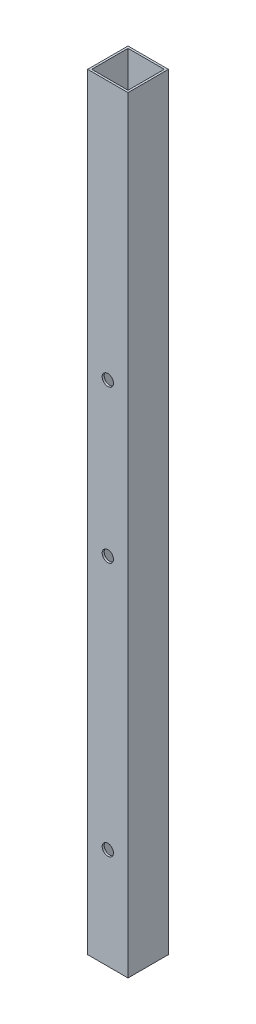
ISO-10303-21;
HEADER;
FILE_DESCRIPTION(('STEP AP214'),'2;1');
FILE_NAME('part.step','',(''),(''),'','','');
FILE_SCHEMA(('AUTOMOTIVE_DESIGN { 1 0 10303 214 1 1 1 1 }'));
ENDSEC;
DATA;
#1=APPLICATION_CONTEXT('core data for automotive mechanical design processes');
#2=APPLICATION_PROTOCOL_DEFINITION('international standard','automotive_design',2000,#1);
#3=PRODUCT_CONTEXT('',#1,'mechanical');
#4=PRODUCT('Part','Part','',(#3));
#5=PRODUCT_RELATED_PRODUCT_CATEGORY('part','',(#4));
#6=PRODUCT_DEFINITION_FORMATION('','',#4);
#7=PRODUCT_DEFINITION_CONTEXT('part definition',#1,'design');
#8=PRODUCT_DEFINITION('design','',#6,#7);
#9=PRODUCT_DEFINITION_SHAPE('','',#8);
#10=(LENGTH_UNIT() NAMED_UNIT(*) SI_UNIT(.MILLI.,.METRE.));
#11=(NAMED_UNIT(*) PLANE_ANGLE_UNIT() SI_UNIT($,.RADIAN.));
#12=(NAMED_UNIT(*) SI_UNIT($,.STERADIAN.) SOLID_ANGLE_UNIT());
#13=UNCERTAINTY_MEASURE_WITH_UNIT(LENGTH_MEASURE(1.E-05),#10,'distance_accuracy_value','');
#14=(GEOMETRIC_REPRESENTATION_CONTEXT(3) GLOBAL_UNCERTAINTY_ASSIGNED_CONTEXT((#13)) GLOBAL_UNIT_ASSIGNED_CONTEXT((#10,
#11,#12)) REPRESENTATION_CONTEXT('',''));
#15=CARTESIAN_POINT('',(0.,0.,0.));
#16=DIRECTION('',(0.,0.,1.));
#17=DIRECTION('',(1.,0.,0.));
#18=AXIS2_PLACEMENT_3D('',#15,#16,#17);
#19=CARTESIAN_POINT('',(0.,482.6,0.));
#20=DIRECTION('',(0.,-1.,0.));
#21=DIRECTION('',(0.,0.,-1.));
#22=AXIS2_PLACEMENT_3D('',#19,#20,#21);
#23=PLANE('',#22);
#24=DIRECTION('',(1.,0.,0.));
#25=VECTOR('',#24,1.);
#26=CARTESIAN_POINT('',(25.4,482.6,0.));
#27=LINE('',#26,#25);
#28=CARTESIAN_POINT('',(0.,482.6,0.));
#29=VERTEX_POINT('',#28);
#30=CARTESIAN_POINT('',(25.4,482.6,0.));
#31=VERTEX_POINT('',#30);
#32=EDGE_CURVE('E143',#29,#31,#27,.T.);
#33=ORIENTED_EDGE('',*,*,#32,.T.);
#34=DIRECTION('',(0.,0.,-1.));
#35=VECTOR('',#34,1.);
#36=CARTESIAN_POINT('',(25.4,482.6,-25.4));
#37=LINE('',#36,#35);
#38=CARTESIAN_POINT('',(25.4,482.6,-25.4));
#39=VERTEX_POINT('',#38);
#40=EDGE_CURVE('E146',#31,#39,#37,.T.);
#41=ORIENTED_EDGE('',*,*,#40,.T.);
#42=DIRECTION('',(-1.,0.,0.));
#43=VECTOR('',#42,1.);
#44=CARTESIAN_POINT('',(0.,482.6,-25.4));
#45=LINE('',#44,#43);
#46=CARTESIAN_POINT('',(0.,482.6,-25.4));
#47=VERTEX_POINT('',#46);
#48=EDGE_CURVE('E149',#39,#47,#45,.T.);
#49=ORIENTED_EDGE('',*,*,#48,.T.);
#50=DIRECTION('',(0.,0.,1.));
#51=VECTOR('',#50,1.);
#52=CARTESIAN_POINT('',(0.,482.6,0.));
#53=LINE('',#52,#51);
#54=EDGE_CURVE('E151',#47,#29,#53,.T.);
#55=ORIENTED_EDGE('',*,*,#54,.T.);
#56=EDGE_LOOP('',(#33,#41,#49,#55));
#57=FACE_BOUND('',#56,.T.);
#58=DIRECTION('',(1.,0.,0.));
#59=VECTOR('',#58,1.);
#60=CARTESIAN_POINT('',(1.27,482.6,-1.27));
#61=LINE('',#60,#59);
#62=CARTESIAN_POINT('',(1.27,482.6,-1.27));
#63=VERTEX_POINT('',#62);
#64=CARTESIAN_POINT('',(24.13,482.6,-1.27));
#65=VERTEX_POINT('',#64);
#66=EDGE_CURVE('E108',#63,#65,#61,.T.);
#67=ORIENTED_EDGE('',*,*,#66,.F.);
#68=DIRECTION('',(0.,0.,1.));
#69=VECTOR('',#68,1.);
#70=CARTESIAN_POINT('',(1.27,482.6,-12.3614591557052));
#71=LINE('',#70,#69);
#72=CARTESIAN_POINT('',(1.27,482.6,-24.13));
#73=VERTEX_POINT('',#72);
#74=EDGE_CURVE('E103',#73,#63,#71,.T.);
#75=ORIENTED_EDGE('',*,*,#74,.F.);
#76=DIRECTION('',(-1.,0.,0.));
#77=VECTOR('',#76,1.);
#78=CARTESIAN_POINT('',(12.7,482.6,-24.13));
#79=LINE('',#78,#77);
#80=CARTESIAN_POINT('',(24.13,482.6,-24.13));
#81=VERTEX_POINT('',#80);
#82=EDGE_CURVE('E124',#81,#73,#79,.T.);
#83=ORIENTED_EDGE('',*,*,#82,.F.);
#84=DIRECTION('',(0.,0.,-1.));
#85=VECTOR('',#84,1.);
#86=CARTESIAN_POINT('',(24.13,482.6,-1.27));
#87=LINE('',#86,#85);
#88=EDGE_CURVE('E122',#65,#81,#87,.T.);
#89=ORIENTED_EDGE('',*,*,#88,.F.);
#90=EDGE_LOOP('',(#67,#75,#83,#89));
#91=FACE_BOUND('',#90,.T.);
#92=ADVANCED_FACE('F39',(#57,#91),#23,.F.);
#93=CARTESIAN_POINT('',(0.,0.,0.));
#94=DIRECTION('',(0.,-1.,0.));
#95=DIRECTION('',(0.,0.,-1.));
#96=AXIS2_PLACEMENT_3D('',#93,#94,#95);
#97=PLANE('',#96);
#98=DIRECTION('',(1.,0.,0.));
#99=VECTOR('',#98,1.);
#100=CARTESIAN_POINT('',(25.4,0.,0.));
#101=LINE('',#100,#99);
#102=CARTESIAN_POINT('',(0.,0.,0.));
#103=VERTEX_POINT('',#102);
#104=CARTESIAN_POINT('',(25.4,0.,0.));
#105=VERTEX_POINT('',#104);
#106=EDGE_CURVE('E118',#103,#105,#101,.T.);
#107=ORIENTED_EDGE('',*,*,#106,.F.);
#108=DIRECTION('',(0.,0.,1.));
#109=VECTOR('',#108,1.);
#110=CARTESIAN_POINT('',(0.,0.,0.));
#111=LINE('',#110,#109);
#112=CARTESIAN_POINT('',(0.,0.,-25.4));
#113=VERTEX_POINT('',#112);
#114=EDGE_CURVE('E147',#113,#103,#111,.T.);
#115=ORIENTED_EDGE('',*,*,#114,.F.);
#116=DIRECTION('',(-1.,0.,0.));
#117=VECTOR('',#116,1.);
#118=CARTESIAN_POINT('',(0.,0.,-25.4));
#119=LINE('',#118,#117);
#120=CARTESIAN_POINT('',(25.4,0.,-25.4));
#121=VERTEX_POINT('',#120);
#122=EDGE_CURVE('E158',#121,#113,#119,.T.);
#123=ORIENTED_EDGE('',*,*,#122,.F.);
#124=DIRECTION('',(0.,0.,-1.));
#125=VECTOR('',#124,1.);
#126=CARTESIAN_POINT('',(25.4,0.,-25.4));
#127=LINE('',#126,#125);
#128=EDGE_CURVE('E156',#105,#121,#127,.T.);
#129=ORIENTED_EDGE('',*,*,#128,.F.);
#130=EDGE_LOOP('',(#107,#115,#123,#129));
#131=FACE_BOUND('',#130,.T.);
#132=DIRECTION('',(0.,0.,1.));
#133=VECTOR('',#132,1.);
#134=CARTESIAN_POINT('',(1.27,0.,-12.3614591557052));
#135=LINE('',#134,#133);
#136=CARTESIAN_POINT('',(1.27,0.,-24.13));
#137=VERTEX_POINT('',#136);
#138=CARTESIAN_POINT('',(1.27,0.,-1.27));
#139=VERTEX_POINT('',#138);
#140=EDGE_CURVE('E109',#137,#139,#135,.T.);
#141=ORIENTED_EDGE('',*,*,#140,.T.);
#142=DIRECTION('',(1.,0.,0.));
#143=VECTOR('',#142,1.);
#144=CARTESIAN_POINT('',(24.13,0.,-1.27));
#145=LINE('',#144,#143);
#146=CARTESIAN_POINT('',(24.13,0.,-1.27));
#147=VERTEX_POINT('',#146);
#148=EDGE_CURVE('E116',#139,#147,#145,.T.);
#149=ORIENTED_EDGE('',*,*,#148,.T.);
#150=DIRECTION('',(0.,0.,-1.));
#151=VECTOR('',#150,1.);
#152=CARTESIAN_POINT('',(24.13,0.,-24.13));
#153=LINE('',#152,#151);
#154=CARTESIAN_POINT('',(24.13,0.,-24.13));
#155=VERTEX_POINT('',#154);
#156=EDGE_CURVE('E130',#147,#155,#153,.T.);
#157=ORIENTED_EDGE('',*,*,#156,.T.);
#158=DIRECTION('',(-1.,0.,0.));
#159=VECTOR('',#158,1.);
#160=CARTESIAN_POINT('',(1.27,0.,-24.13));
#161=LINE('',#160,#159);
#162=EDGE_CURVE('E134',#155,#137,#161,.T.);
#163=ORIENTED_EDGE('',*,*,#162,.T.);
#164=EDGE_LOOP('',(#141,#149,#157,#163));
#165=FACE_BOUND('',#164,.T.);
#166=ADVANCED_FACE('F223',(#131,#165),#97,.T.);
#167=CARTESIAN_POINT('',(25.4,482.6,0.));
#168=DIRECTION('',(0.,0.,-1.));
#169=DIRECTION('',(-1.,0.,0.));
#170=AXIS2_PLACEMENT_3D('',#167,#168,#169);
#171=PLANE('',#170);
#172=CARTESIAN_POINT('',(12.6999999999991,223.6,0.));
#173=DIRECTION('',(0.,0.,1.));
#174=DIRECTION('',(1.,0.,0.));
#175=AXIS2_PLACEMENT_3D('',#172,#173,#174);
#176=CIRCLE('',#175,3.55599999999999);
#177=CARTESIAN_POINT('',(16.2559999999991,223.6,0.));
#178=VERTEX_POINT('',#177);
#179=EDGE_CURVE('E184',#178,#178,#176,.T.);
#180=ORIENTED_EDGE('',*,*,#179,.F.);
#181=EDGE_LOOP('',(#180));
#182=FACE_BOUND('',#181,.T.);
#183=CARTESIAN_POINT('',(12.6999999999994,319.6,0.));
#184=DIRECTION('',(0.,0.,1.));
#185=DIRECTION('',(1.,0.,0.));
#186=AXIS2_PLACEMENT_3D('',#183,#184,#185);
#187=CIRCLE('',#186,3.55599999999999);
#188=CARTESIAN_POINT('',(16.2559999999994,319.6,0.));
#189=VERTEX_POINT('',#188);
#190=EDGE_CURVE('E189',#189,#189,#187,.T.);
#191=ORIENTED_EDGE('',*,*,#190,.F.);
#192=EDGE_LOOP('',(#191));
#193=FACE_BOUND('',#192,.T.);
#194=CARTESIAN_POINT('',(12.6999999999985,63.552,0.));
#195=DIRECTION('',(0.,0.,1.));
#196=DIRECTION('',(1.,0.,0.));
#197=AXIS2_PLACEMENT_3D('',#194,#195,#196);
#198=CIRCLE('',#197,3.556);
#199=CARTESIAN_POINT('',(16.2559999999985,63.552,0.));
#200=VERTEX_POINT('',#199);
#201=EDGE_CURVE('E181',#200,#200,#198,.T.);
#202=ORIENTED_EDGE('',*,*,#201,.F.);
#203=EDGE_LOOP('',(#202));
#204=FACE_BOUND('',#203,.T.);
#205=ORIENTED_EDGE('',*,*,#106,.T.);
#206=DIRECTION('',(0.,-1.,0.));
#207=VECTOR('',#206,1.);
#208=CARTESIAN_POINT('',(25.4,482.6,0.));
#209=LINE('',#208,#207);
#210=EDGE_CURVE('E11',#31,#105,#209,.T.);
#211=ORIENTED_EDGE('',*,*,#210,.F.);
#212=ORIENTED_EDGE('',*,*,#32,.F.);
#213=DIRECTION('',(0.,-1.,0.));
#214=VECTOR('',#213,1.);
#215=CARTESIAN_POINT('',(0.,482.6,0.));
#216=LINE('',#215,#214);
#217=EDGE_CURVE('E153',#29,#103,#216,.T.);
#218=ORIENTED_EDGE('',*,*,#217,.T.);
#219=EDGE_LOOP('',(#205,#211,#212,#218));
#220=FACE_BOUND('',#219,.T.);
#221=ADVANCED_FACE('F41',(#182,#193,#204,#220),#171,.F.);
#222=CARTESIAN_POINT('',(25.4,482.6,-25.4));
#223=DIRECTION('',(-1.,0.,0.));
#224=DIRECTION('',(0.,0.,1.));
#225=AXIS2_PLACEMENT_3D('',#222,#223,#224);
#226=PLANE('',#225);
#227=ORIENTED_EDGE('',*,*,#128,.T.);
#228=DIRECTION('',(0.,-1.,0.));
#229=VECTOR('',#228,1.);
#230=CARTESIAN_POINT('',(25.4,482.6,-25.4));
#231=LINE('',#230,#229);
#232=EDGE_CURVE('E48',#39,#121,#231,.T.);
#233=ORIENTED_EDGE('',*,*,#232,.F.);
#234=ORIENTED_EDGE('',*,*,#40,.F.);
#235=ORIENTED_EDGE('',*,*,#210,.T.);
#236=EDGE_LOOP('',(#227,#233,#234,#235));
#237=FACE_BOUND('',#236,.T.);
#238=ADVANCED_FACE('F210',(#237),#226,.F.);
#239=CARTESIAN_POINT('',(0.,482.6,-25.4));
#240=DIRECTION('',(0.,0.,1.));
#241=DIRECTION('',(1.,0.,0.));
#242=AXIS2_PLACEMENT_3D('',#239,#240,#241);
#243=PLANE('',#242);
#244=CARTESIAN_POINT('',(12.715968996325,18.417917659562,-25.4));
#245=DIRECTION('',(0.,0.,-1.));
#246=DIRECTION('',(-1.,0.,0.));
#247=AXIS2_PLACEMENT_3D('',#244,#245,#246);
#248=CIRCLE('',#247,2.54);
#249=CARTESIAN_POINT('',(10.175968996325,18.417917659562,-25.4));
#250=VERTEX_POINT('',#249);
#251=EDGE_CURVE('E178',#250,#250,#248,.T.);
#252=ORIENTED_EDGE('',*,*,#251,.F.);
#253=EDGE_LOOP('',(#252));
#254=FACE_BOUND('',#253,.T.);
#255=CARTESIAN_POINT('',(12.7005737102053,321.200750094424,-25.4));
#256=DIRECTION('',(0.,0.,-1.));
#257=DIRECTION('',(-1.,0.,0.));
#258=AXIS2_PLACEMENT_3D('',#255,#256,#257);
#259=CIRCLE('',#258,2.54);
#260=CARTESIAN_POINT('',(10.1605737102053,321.200750094424,-25.4));
#261=VERTEX_POINT('',#260);
#262=EDGE_CURVE('E174',#261,#261,#259,.T.);
#263=ORIENTED_EDGE('',*,*,#262,.F.);
#264=EDGE_LOOP('',(#263));
#265=FACE_BOUND('',#264,.T.);
#266=CARTESIAN_POINT('',(12.762028980859,449.168015032484,-25.4));
#267=DIRECTION('',(0.,0.,-1.));
#268=DIRECTION('',(-1.,0.,0.));
#269=AXIS2_PLACEMENT_3D('',#266,#267,#268);
#270=CIRCLE('',#269,2.54);
#271=CARTESIAN_POINT('',(10.222028980859,449.168015032484,-25.4));
#272=VERTEX_POINT('',#271);
#273=EDGE_CURVE('E170',#272,#272,#270,.T.);
#274=ORIENTED_EDGE('',*,*,#273,.F.);
#275=EDGE_LOOP('',(#274));
#276=FACE_BOUND('',#275,.T.);
#277=ORIENTED_EDGE('',*,*,#122,.T.);
#278=DIRECTION('',(0.,-1.,0.));
#279=VECTOR('',#278,1.);
#280=CARTESIAN_POINT('',(0.,482.6,-25.4));
#281=LINE('',#280,#279);
#282=EDGE_CURVE('E163',#47,#113,#281,.T.);
#283=ORIENTED_EDGE('',*,*,#282,.F.);
#284=ORIENTED_EDGE('',*,*,#48,.F.);
#285=ORIENTED_EDGE('',*,*,#232,.T.);
#286=EDGE_LOOP('',(#277,#283,#284,#285));
#287=FACE_BOUND('',#286,.T.);
#288=ADVANCED_FACE('F206',(#254,#265,#276,#287),#243,.F.);
#289=CARTESIAN_POINT('',(0.,482.6,0.));
#290=DIRECTION('',(1.,0.,0.));
#291=DIRECTION('',(0.,0.,-1.));
#292=AXIS2_PLACEMENT_3D('',#289,#290,#291);
#293=PLANE('',#292);
#294=ORIENTED_EDGE('',*,*,#114,.T.);
#295=ORIENTED_EDGE('',*,*,#217,.F.);
#296=ORIENTED_EDGE('',*,*,#54,.F.);
#297=ORIENTED_EDGE('',*,*,#282,.T.);
#298=EDGE_LOOP('',(#294,#295,#296,#297));
#299=FACE_BOUND('',#298,.T.);
#300=ADVANCED_FACE('F209',(#299),#293,.F.);
#301=CARTESIAN_POINT('',(24.13,482.6,-1.27));
#302=DIRECTION('',(0.,0.,-1.));
#303=DIRECTION('',(-1.,0.,0.));
#304=AXIS2_PLACEMENT_3D('',#301,#302,#303);
#305=PLANE('',#304);
#306=CARTESIAN_POINT('',(12.6999999999991,223.6,-1.27));
#307=DIRECTION('',(0.,0.,-1.));
#308=DIRECTION('',(-1.,0.,0.));
#309=AXIS2_PLACEMENT_3D('',#306,#307,#308);
#310=CIRCLE('',#309,3.55599999999999);
#311=CARTESIAN_POINT('',(9.1439999999991,223.6,-1.27));
#312=VERTEX_POINT('',#311);
#313=EDGE_CURVE('E43',#312,#312,#310,.T.);
#314=ORIENTED_EDGE('',*,*,#313,.F.);
#315=EDGE_LOOP('',(#314));
#316=FACE_BOUND('',#315,.T.);
#317=CARTESIAN_POINT('',(12.6999999999994,319.6,-1.27));
#318=DIRECTION('',(0.,0.,-1.));
#319=DIRECTION('',(-1.,0.,0.));
#320=AXIS2_PLACEMENT_3D('',#317,#318,#319);
#321=CIRCLE('',#320,3.55599999999999);
#322=CARTESIAN_POINT('',(9.14399999999943,319.6,-1.27));
#323=VERTEX_POINT('',#322);
#324=EDGE_CURVE('E182',#323,#323,#321,.T.);
#325=ORIENTED_EDGE('',*,*,#324,.F.);
#326=EDGE_LOOP('',(#325));
#327=FACE_BOUND('',#326,.T.);
#328=CARTESIAN_POINT('',(12.6999999999985,63.552,-1.27));
#329=DIRECTION('',(0.,0.,-1.));
#330=DIRECTION('',(-1.,0.,0.));
#331=AXIS2_PLACEMENT_3D('',#328,#329,#330);
#332=CIRCLE('',#331,3.556);
#333=CARTESIAN_POINT('',(9.14399999999853,63.552,-1.27));
#334=VERTEX_POINT('',#333);
#335=EDGE_CURVE('E179',#334,#334,#332,.T.);
#336=ORIENTED_EDGE('',*,*,#335,.F.);
#337=EDGE_LOOP('',(#336));
#338=FACE_BOUND('',#337,.T.);
#339=ORIENTED_EDGE('',*,*,#148,.F.);
#340=DIRECTION('',(0.,-1.,0.));
#341=VECTOR('',#340,1.);
#342=CARTESIAN_POINT('',(1.27,482.6,-1.27));
#343=LINE('',#342,#341);
#344=EDGE_CURVE('E61',#63,#139,#343,.T.);
#345=ORIENTED_EDGE('',*,*,#344,.F.);
#346=ORIENTED_EDGE('',*,*,#66,.T.);
#347=DIRECTION('',(0.,-1.,0.));
#348=VECTOR('',#347,1.);
#349=CARTESIAN_POINT('',(24.13,482.6,-1.27));
#350=LINE('',#349,#348);
#351=EDGE_CURVE('E119',#65,#147,#350,.T.);
#352=ORIENTED_EDGE('',*,*,#351,.T.);
#353=EDGE_LOOP('',(#339,#345,#346,#352));
#354=FACE_BOUND('',#353,.T.);
#355=ADVANCED_FACE('F112',(#316,#327,#338,#354),#305,.T.);
#356=CARTESIAN_POINT('',(24.13,482.6,-24.13));
#357=DIRECTION('',(-1.,0.,0.));
#358=DIRECTION('',(0.,0.,1.));
#359=AXIS2_PLACEMENT_3D('',#356,#357,#358);
#360=PLANE('',#359);
#361=ORIENTED_EDGE('',*,*,#156,.F.);
#362=ORIENTED_EDGE('',*,*,#351,.F.);
#363=ORIENTED_EDGE('',*,*,#88,.T.);
#364=DIRECTION('',(0.,-1.,0.));
#365=VECTOR('',#364,1.);
#366=CARTESIAN_POINT('',(24.13,482.6,-24.13));
#367=LINE('',#366,#365);
#368=EDGE_CURVE('E139',#81,#155,#367,.T.);
#369=ORIENTED_EDGE('',*,*,#368,.T.);
#370=EDGE_LOOP('',(#361,#362,#363,#369));
#371=FACE_BOUND('',#370,.T.);
#372=ADVANCED_FACE('F251',(#371),#360,.T.);
#373=CARTESIAN_POINT('',(1.27,482.6,-24.13));
#374=DIRECTION('',(0.,0.,1.));
#375=DIRECTION('',(1.,0.,0.));
#376=AXIS2_PLACEMENT_3D('',#373,#374,#375);
#377=PLANE('',#376);
#378=CARTESIAN_POINT('',(12.715968996325,18.417917659562,-24.13));
#379=DIRECTION('',(0.,0.,1.));
#380=DIRECTION('',(1.,0.,0.));
#381=AXIS2_PLACEMENT_3D('',#378,#379,#380);
#382=CIRCLE('',#381,2.54);
#383=CARTESIAN_POINT('',(15.255968996325,18.417917659562,-24.13));
#384=VERTEX_POINT('',#383);
#385=EDGE_CURVE('E175',#384,#384,#382,.T.);
#386=ORIENTED_EDGE('',*,*,#385,.F.);
#387=EDGE_LOOP('',(#386));
#388=FACE_BOUND('',#387,.T.);
#389=CARTESIAN_POINT('',(12.7005737102053,321.200750094424,-24.13));
#390=DIRECTION('',(0.,0.,1.));
#391=DIRECTION('',(1.,0.,0.));
#392=AXIS2_PLACEMENT_3D('',#389,#390,#391);
#393=CIRCLE('',#392,2.54);
#394=CARTESIAN_POINT('',(15.2405737102053,321.200750094424,-24.13));
#395=VERTEX_POINT('',#394);
#396=EDGE_CURVE('E171',#395,#395,#393,.T.);
#397=ORIENTED_EDGE('',*,*,#396,.F.);
#398=EDGE_LOOP('',(#397));
#399=FACE_BOUND('',#398,.T.);
#400=CARTESIAN_POINT('',(12.762028980859,449.168015032484,-24.13));
#401=DIRECTION('',(0.,0.,1.));
#402=DIRECTION('',(1.,0.,0.));
#403=AXIS2_PLACEMENT_3D('',#400,#401,#402);
#404=CIRCLE('',#403,2.54);
#405=CARTESIAN_POINT('',(15.302028980859,449.168015032484,-24.13));
#406=VERTEX_POINT('',#405);
#407=EDGE_CURVE('E131',#406,#406,#404,.T.);
#408=ORIENTED_EDGE('',*,*,#407,.F.);
#409=EDGE_LOOP('',(#408));
#410=FACE_BOUND('',#409,.T.);
#411=ORIENTED_EDGE('',*,*,#162,.F.);
#412=ORIENTED_EDGE('',*,*,#368,.F.);
#413=ORIENTED_EDGE('',*,*,#82,.T.);
#414=DIRECTION('',(0.,-1.,0.));
#415=VECTOR('',#414,1.);
#416=CARTESIAN_POINT('',(1.27,482.6,-24.13));
#417=LINE('',#416,#415);
#418=EDGE_CURVE('E56',#73,#137,#417,.T.);
#419=ORIENTED_EDGE('',*,*,#418,.T.);
#420=EDGE_LOOP('',(#411,#412,#413,#419));
#421=FACE_BOUND('',#420,.T.);
#422=ADVANCED_FACE('F256',(#388,#399,#410,#421),#377,.T.);
#423=CARTESIAN_POINT('',(1.27,482.6,-12.3614591557052));
#424=DIRECTION('',(1.,0.,0.));
#425=DIRECTION('',(0.,0.,-1.));
#426=AXIS2_PLACEMENT_3D('',#423,#424,#425);
#427=PLANE('',#426);
#428=ORIENTED_EDGE('',*,*,#140,.F.);
#429=ORIENTED_EDGE('',*,*,#418,.F.);
#430=ORIENTED_EDGE('',*,*,#74,.T.);
#431=ORIENTED_EDGE('',*,*,#344,.T.);
#432=EDGE_LOOP('',(#428,#429,#430,#431));
#433=FACE_BOUND('',#432,.T.);
#434=ADVANCED_FACE('F104',(#433),#427,.T.);
#435=CARTESIAN_POINT('',(12.762028980859,449.168015032484,-22.86));
#436=DIRECTION('',(0.,0.,-1.));
#437=DIRECTION('',(-1.,0.,0.));
#438=AXIS2_PLACEMENT_3D('',#435,#436,#437);
#439=CYLINDRICAL_SURFACE('',#438,2.54);
#440=ORIENTED_EDGE('',*,*,#407,.T.);
#441=EDGE_LOOP('',(#440));
#442=FACE_BOUND('',#441,.T.);
#443=ORIENTED_EDGE('',*,*,#273,.T.);
#444=EDGE_LOOP('',(#443));
#445=FACE_BOUND('',#444,.T.);
#446=ADVANCED_FACE('F204',(#442,#445),#439,.F.);
#447=CARTESIAN_POINT('',(12.7005737102053,321.200750094424,-22.86));
#448=DIRECTION('',(0.,0.,-1.));
#449=DIRECTION('',(-1.,0.,0.));
#450=AXIS2_PLACEMENT_3D('',#447,#448,#449);
#451=CYLINDRICAL_SURFACE('',#450,2.54);
#452=ORIENTED_EDGE('',*,*,#396,.T.);
#453=EDGE_LOOP('',(#452));
#454=FACE_BOUND('',#453,.T.);
#455=ORIENTED_EDGE('',*,*,#262,.T.);
#456=EDGE_LOOP('',(#455));
#457=FACE_BOUND('',#456,.T.);
#458=ADVANCED_FACE('F277',(#454,#457),#451,.F.);
#459=CARTESIAN_POINT('',(12.715968996325,18.417917659562,-22.86));
#460=DIRECTION('',(0.,0.,-1.));
#461=DIRECTION('',(-1.,0.,0.));
#462=AXIS2_PLACEMENT_3D('',#459,#460,#461);
#463=CYLINDRICAL_SURFACE('',#462,2.54);
#464=ORIENTED_EDGE('',*,*,#385,.T.);
#465=EDGE_LOOP('',(#464));
#466=FACE_BOUND('',#465,.T.);
#467=ORIENTED_EDGE('',*,*,#251,.T.);
#468=EDGE_LOOP('',(#467));
#469=FACE_BOUND('',#468,.T.);
#470=ADVANCED_FACE('F267',(#466,#469),#463,.F.);
#471=CARTESIAN_POINT('',(12.6999999999985,63.552,-2.54));
#472=DIRECTION('',(0.,0.,1.));
#473=DIRECTION('',(1.,0.,0.));
#474=AXIS2_PLACEMENT_3D('',#471,#472,#473);
#475=CYLINDRICAL_SURFACE('',#474,3.556);
#476=ORIENTED_EDGE('',*,*,#335,.T.);
#477=EDGE_LOOP('',(#476));
#478=FACE_BOUND('',#477,.T.);
#479=ORIENTED_EDGE('',*,*,#201,.T.);
#480=EDGE_LOOP('',(#479));
#481=FACE_BOUND('',#480,.T.);
#482=ADVANCED_FACE('F263',(#478,#481),#475,.F.);
#483=CARTESIAN_POINT('',(12.6999999999994,319.6,-2.54));
#484=DIRECTION('',(0.,0.,1.));
#485=DIRECTION('',(1.,0.,0.));
#486=AXIS2_PLACEMENT_3D('',#483,#484,#485);
#487=CYLINDRICAL_SURFACE('',#486,3.55599999999999);
#488=ORIENTED_EDGE('',*,*,#324,.T.);
#489=EDGE_LOOP('',(#488));
#490=FACE_BOUND('',#489,.T.);
#491=ORIENTED_EDGE('',*,*,#190,.T.);
#492=EDGE_LOOP('',(#491));
#493=FACE_BOUND('',#492,.T.);
#494=ADVANCED_FACE('F266',(#490,#493),#487,.F.);
#495=CARTESIAN_POINT('',(12.6999999999991,223.6,-2.54));
#496=DIRECTION('',(0.,0.,1.));
#497=DIRECTION('',(1.,0.,0.));
#498=AXIS2_PLACEMENT_3D('',#495,#496,#497);
#499=CYLINDRICAL_SURFACE('',#498,3.55599999999999);
#500=ORIENTED_EDGE('',*,*,#313,.T.);
#501=EDGE_LOOP('',(#500));
#502=FACE_BOUND('',#501,.T.);
#503=ORIENTED_EDGE('',*,*,#179,.T.);
#504=EDGE_LOOP('',(#503));
#505=FACE_BOUND('',#504,.T.);
#506=ADVANCED_FACE('F275',(#502,#505),#499,.F.);
#507=CLOSED_SHELL('',(#92,#166,#221,#238,#288,#300,#355,#372,#422,#434,#446,#458,#470,#482,#494,#506));
#508=MANIFOLD_SOLID_BREP('B2',#507);
#509=ADVANCED_BREP_SHAPE_REPRESENTATION('',(#18,#508),#14);
#510=SHAPE_DEFINITION_REPRESENTATION(#9,#509);
ENDSEC;
END-ISO-10303-21;
